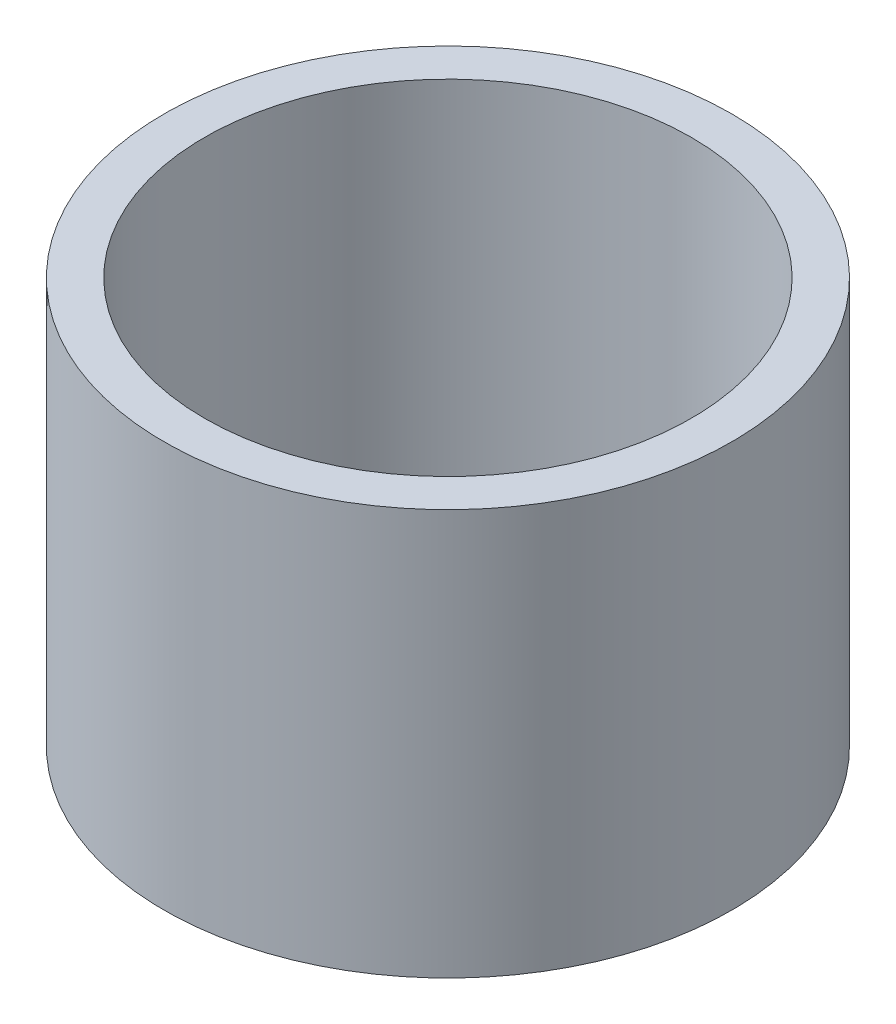
ISO-10303-21;
HEADER;
FILE_DESCRIPTION(('STEP AP214'),'2;1');
FILE_NAME('part.step','',(''),(''),'','','');
FILE_SCHEMA(('AUTOMOTIVE_DESIGN { 1 0 10303 214 1 1 1 1 }'));
ENDSEC;
DATA;
#1=APPLICATION_CONTEXT('core data for automotive mechanical design processes');
#2=APPLICATION_PROTOCOL_DEFINITION('international standard','automotive_design',2000,#1);
#3=PRODUCT_CONTEXT('',#1,'mechanical');
#4=PRODUCT('Part','Part','',(#3));
#5=PRODUCT_RELATED_PRODUCT_CATEGORY('part','',(#4));
#6=PRODUCT_DEFINITION_FORMATION('','',#4);
#7=PRODUCT_DEFINITION_CONTEXT('part definition',#1,'design');
#8=PRODUCT_DEFINITION('design','',#6,#7);
#9=PRODUCT_DEFINITION_SHAPE('','',#8);
#10=(LENGTH_UNIT() NAMED_UNIT(*) SI_UNIT(.MILLI.,.METRE.));
#11=(NAMED_UNIT(*) PLANE_ANGLE_UNIT() SI_UNIT($,.RADIAN.));
#12=(NAMED_UNIT(*) SI_UNIT($,.STERADIAN.) SOLID_ANGLE_UNIT());
#13=UNCERTAINTY_MEASURE_WITH_UNIT(LENGTH_MEASURE(1.E-05),#10,'distance_accuracy_value','');
#14=(GEOMETRIC_REPRESENTATION_CONTEXT(3) GLOBAL_UNCERTAINTY_ASSIGNED_CONTEXT((#13)) GLOBAL_UNIT_ASSIGNED_CONTEXT((#10,
#11,#12)) REPRESENTATION_CONTEXT('',''));
#15=CARTESIAN_POINT('',(0.,0.,0.));
#16=DIRECTION('',(0.,0.,1.));
#17=DIRECTION('',(1.,0.,0.));
#18=AXIS2_PLACEMENT_3D('',#15,#16,#17);
#19=CARTESIAN_POINT('',(-11.980856658486,15.875,0.));
#20=DIRECTION('',(0.,-1.,0.));
#21=DIRECTION('',(0.,0.,-1.));
#22=AXIS2_PLACEMENT_3D('',#19,#20,#21);
#23=CYLINDRICAL_SURFACE('',#22,19.05);
#24=CARTESIAN_POINT('',(-11.980856658486,0.,0.));
#25=DIRECTION('',(0.,-1.,0.));
#26=DIRECTION('',(0.,0.,-1.));
#27=AXIS2_PLACEMENT_3D('',#24,#25,#26);
#28=CIRCLE('',#27,19.05);
#29=CARTESIAN_POINT('',(-11.980856658486,0.,-19.05));
#30=VERTEX_POINT('',#29);
#31=EDGE_CURVE('E18',#30,#30,#28,.F.);
#32=ORIENTED_EDGE('',*,*,#31,.F.);
#33=EDGE_LOOP('',(#32));
#34=FACE_BOUND('',#33,.T.);
#35=CARTESIAN_POINT('',(-11.980856658486,31.75,0.));
#36=DIRECTION('',(0.,-1.,0.));
#37=DIRECTION('',(0.,0.,-1.));
#38=AXIS2_PLACEMENT_3D('',#35,#36,#37);
#39=CIRCLE('',#38,19.05);
#40=CARTESIAN_POINT('',(-11.980856658486,31.75,-19.05));
#41=VERTEX_POINT('',#40);
#42=EDGE_CURVE('E27',#41,#41,#39,.T.);
#43=ORIENTED_EDGE('',*,*,#42,.F.);
#44=EDGE_LOOP('',(#43));
#45=FACE_BOUND('',#44,.T.);
#46=ADVANCED_FACE('F15',(#34,#45),#23,.F.);
#47=CARTESIAN_POINT('',(8.65664334151397,0.,0.));
#48=DIRECTION('',(0.,-1.,0.));
#49=DIRECTION('',(0.,0.,-1.));
#50=AXIS2_PLACEMENT_3D('',#47,#48,#49);
#51=PLANE('',#50);
#52=CARTESIAN_POINT('',(-11.980856658486,0.,0.));
#53=DIRECTION('',(0.,-1.,0.));
#54=DIRECTION('',(0.,0.,-1.));
#55=AXIS2_PLACEMENT_3D('',#52,#53,#54);
#56=CIRCLE('',#55,22.225);
#57=CARTESIAN_POINT('',(-11.980856658486,0.,-22.225));
#58=VERTEX_POINT('',#57);
#59=EDGE_CURVE('E22',#58,#58,#56,.F.);
#60=ORIENTED_EDGE('',*,*,#59,.F.);
#61=EDGE_LOOP('',(#60));
#62=FACE_BOUND('',#61,.T.);
#63=ORIENTED_EDGE('',*,*,#31,.T.);
#64=EDGE_LOOP('',(#63));
#65=FACE_BOUND('',#64,.T.);
#66=ADVANCED_FACE('F35',(#62,#65),#51,.T.);
#67=CARTESIAN_POINT('',(8.65664334151397,31.75,0.));
#68=DIRECTION('',(0.,1.,0.));
#69=DIRECTION('',(0.,0.,1.));
#70=AXIS2_PLACEMENT_3D('',#67,#68,#69);
#71=PLANE('',#70);
#72=ORIENTED_EDGE('',*,*,#42,.T.);
#73=EDGE_LOOP('',(#72));
#74=FACE_BOUND('',#73,.T.);
#75=CARTESIAN_POINT('',(-11.980856658486,31.75,0.));
#76=DIRECTION('',(0.,-1.,0.));
#77=DIRECTION('',(0.,0.,-1.));
#78=AXIS2_PLACEMENT_3D('',#75,#76,#77);
#79=CIRCLE('',#78,22.225);
#80=CARTESIAN_POINT('',(-11.980856658486,31.75,-22.225));
#81=VERTEX_POINT('',#80);
#82=EDGE_CURVE('E10',#81,#81,#79,.T.);
#83=ORIENTED_EDGE('',*,*,#82,.F.);
#84=EDGE_LOOP('',(#83));
#85=FACE_BOUND('',#84,.T.);
#86=ADVANCED_FACE('F43',(#74,#85),#71,.T.);
#87=CARTESIAN_POINT('',(-11.980856658486,15.875,0.));
#88=DIRECTION('',(0.,-1.,0.));
#89=DIRECTION('',(0.,0.,-1.));
#90=AXIS2_PLACEMENT_3D('',#87,#88,#89);
#91=CYLINDRICAL_SURFACE('',#90,22.225);
#92=ORIENTED_EDGE('',*,*,#82,.T.);
#93=EDGE_LOOP('',(#92));
#94=FACE_BOUND('',#93,.T.);
#95=ORIENTED_EDGE('',*,*,#59,.T.);
#96=EDGE_LOOP('',(#95));
#97=FACE_BOUND('',#96,.T.);
#98=ADVANCED_FACE('F45',(#94,#97),#91,.T.);
#99=CLOSED_SHELL('',(#46,#66,#86,#98));
#100=MANIFOLD_SOLID_BREP('B1',#99);
#101=ADVANCED_BREP_SHAPE_REPRESENTATION('',(#18,#100),#14);
#102=SHAPE_DEFINITION_REPRESENTATION(#9,#101);
ENDSEC;
END-ISO-10303-21;
